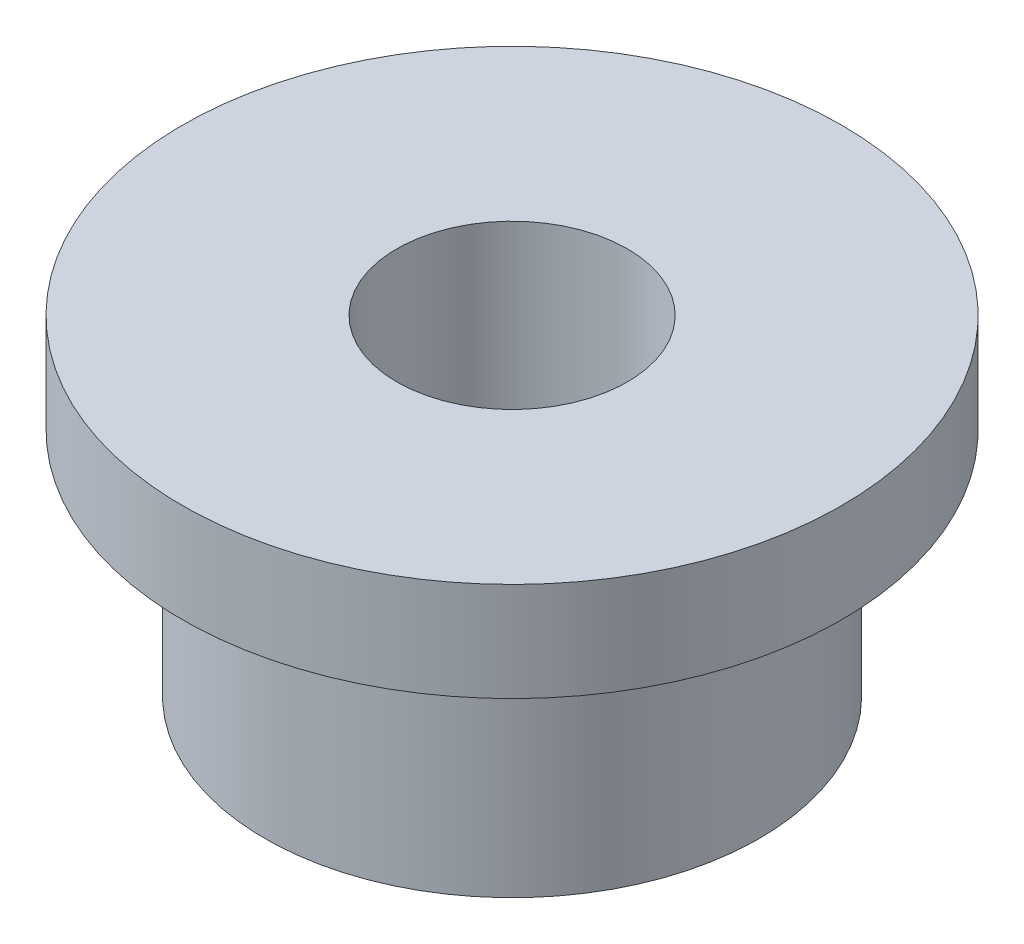
ISO-10303-21;
HEADER;
FILE_DESCRIPTION(('STEP AP214'),'2;1');
FILE_NAME('part.step','',(''),(''),'','','');
FILE_SCHEMA(('AUTOMOTIVE_DESIGN { 1 0 10303 214 1 1 1 1 }'));
ENDSEC;
DATA;
#1=APPLICATION_CONTEXT('core data for automotive mechanical design processes');
#2=APPLICATION_PROTOCOL_DEFINITION('international standard','automotive_design',2000,#1);
#3=PRODUCT_CONTEXT('',#1,'mechanical');
#4=PRODUCT('Part','Part','',(#3));
#5=PRODUCT_RELATED_PRODUCT_CATEGORY('part','',(#4));
#6=PRODUCT_DEFINITION_FORMATION('','',#4);
#7=PRODUCT_DEFINITION_CONTEXT('part definition',#1,'design');
#8=PRODUCT_DEFINITION('design','',#6,#7);
#9=PRODUCT_DEFINITION_SHAPE('','',#8);
#10=(LENGTH_UNIT() NAMED_UNIT(*) SI_UNIT(.MILLI.,.METRE.));
#11=(NAMED_UNIT(*) PLANE_ANGLE_UNIT() SI_UNIT($,.RADIAN.));
#12=(NAMED_UNIT(*) SI_UNIT($,.STERADIAN.) SOLID_ANGLE_UNIT());
#13=UNCERTAINTY_MEASURE_WITH_UNIT(LENGTH_MEASURE(1.E-05),#10,'distance_accuracy_value','');
#14=(GEOMETRIC_REPRESENTATION_CONTEXT(3) GLOBAL_UNCERTAINTY_ASSIGNED_CONTEXT((#13)) GLOBAL_UNIT_ASSIGNED_CONTEXT((#10,
#11,#12)) REPRESENTATION_CONTEXT('',''));
#15=CARTESIAN_POINT('',(0.,0.,0.));
#16=DIRECTION('',(0.,0.,1.));
#17=DIRECTION('',(1.,0.,0.));
#18=AXIS2_PLACEMENT_3D('',#15,#16,#17);
#19=CARTESIAN_POINT('',(0.,0.,0.));
#20=DIRECTION('',(0.,-1.,0.));
#21=DIRECTION('',(0.,0.,-1.));
#22=AXIS2_PLACEMENT_3D('',#19,#20,#21);
#23=CYLINDRICAL_SURFACE('',#22,3.5);
#24=CARTESIAN_POINT('',(0.,0.,0.));
#25=DIRECTION('',(0.,-1.,0.));
#26=DIRECTION('',(0.,0.,-1.));
#27=AXIS2_PLACEMENT_3D('',#24,#25,#26);
#28=CIRCLE('',#27,3.5);
#29=CARTESIAN_POINT('',(0.,0.,-3.5));
#30=VERTEX_POINT('',#29);
#31=EDGE_CURVE('E10',#30,#30,#28,.T.);
#32=ORIENTED_EDGE('',*,*,#31,.T.);
#33=EDGE_LOOP('',(#32));
#34=FACE_BOUND('',#33,.T.);
#35=CARTESIAN_POINT('',(0.,10.,0.));
#36=DIRECTION('',(0.,-1.,0.));
#37=DIRECTION('',(0.,0.,-1.));
#38=AXIS2_PLACEMENT_3D('',#35,#36,#37);
#39=CIRCLE('',#38,3.5);
#40=CARTESIAN_POINT('',(0.,10.,-3.5));
#41=VERTEX_POINT('',#40);
#42=EDGE_CURVE('E63',#41,#41,#39,.T.);
#43=ORIENTED_EDGE('',*,*,#42,.F.);
#44=EDGE_LOOP('',(#43));
#45=FACE_BOUND('',#44,.T.);
#46=ADVANCED_FACE('F41',(#34,#45),#23,.F.);
#47=CARTESIAN_POINT('',(0.,0.,0.));
#48=DIRECTION('',(0.,-1.,0.));
#49=DIRECTION('',(0.,0.,-1.));
#50=AXIS2_PLACEMENT_3D('',#47,#48,#49);
#51=PLANE('',#50);
#52=CARTESIAN_POINT('',(0.,0.,0.));
#53=DIRECTION('',(0.,-1.,0.));
#54=DIRECTION('',(0.,0.,-1.));
#55=AXIS2_PLACEMENT_3D('',#52,#53,#54);
#56=CIRCLE('',#55,7.5);
#57=CARTESIAN_POINT('',(0.,0.,-7.5));
#58=VERTEX_POINT('',#57);
#59=EDGE_CURVE('E47',#58,#58,#56,.T.);
#60=ORIENTED_EDGE('',*,*,#59,.T.);
#61=EDGE_LOOP('',(#60));
#62=FACE_BOUND('',#61,.T.);
#63=ORIENTED_EDGE('',*,*,#31,.F.);
#64=EDGE_LOOP('',(#63));
#65=FACE_BOUND('',#64,.T.);
#66=ADVANCED_FACE('F71',(#62,#65),#51,.T.);
#67=CARTESIAN_POINT('',(0.,0.,0.));
#68=DIRECTION('',(0.,-1.,0.));
#69=DIRECTION('',(0.,0.,-1.));
#70=AXIS2_PLACEMENT_3D('',#67,#68,#69);
#71=CYLINDRICAL_SURFACE('',#70,7.5);
#72=CARTESIAN_POINT('',(0.,7.,0.));
#73=DIRECTION('',(0.,-1.,0.));
#74=DIRECTION('',(0.,0.,-1.));
#75=AXIS2_PLACEMENT_3D('',#72,#73,#74);
#76=CIRCLE('',#75,7.5);
#77=CARTESIAN_POINT('',(0.,7.,-7.5));
#78=VERTEX_POINT('',#77);
#79=EDGE_CURVE('E51',#78,#78,#76,.T.);
#80=ORIENTED_EDGE('',*,*,#79,.T.);
#81=EDGE_LOOP('',(#80));
#82=FACE_BOUND('',#81,.T.);
#83=ORIENTED_EDGE('',*,*,#59,.F.);
#84=EDGE_LOOP('',(#83));
#85=FACE_BOUND('',#84,.T.);
#86=ADVANCED_FACE('F75',(#82,#85),#71,.T.);
#87=CARTESIAN_POINT('',(0.,7.,0.));
#88=DIRECTION('',(0.,1.,0.));
#89=DIRECTION('',(0.,0.,1.));
#90=AXIS2_PLACEMENT_3D('',#87,#88,#89);
#91=PLANE('',#90);
#92=ORIENTED_EDGE('',*,*,#79,.F.);
#93=EDGE_LOOP('',(#92));
#94=FACE_BOUND('',#93,.T.);
#95=CARTESIAN_POINT('',(0.,7.,0.));
#96=DIRECTION('',(0.,-1.,0.));
#97=DIRECTION('',(0.,0.,-1.));
#98=AXIS2_PLACEMENT_3D('',#95,#96,#97);
#99=CIRCLE('',#98,10.);
#100=CARTESIAN_POINT('',(0.,7.,-10.));
#101=VERTEX_POINT('',#100);
#102=EDGE_CURVE('E55',#101,#101,#99,.T.);
#103=ORIENTED_EDGE('',*,*,#102,.T.);
#104=EDGE_LOOP('',(#103));
#105=FACE_BOUND('',#104,.T.);
#106=ADVANCED_FACE('F79',(#94,#105),#91,.F.);
#107=CARTESIAN_POINT('',(0.,0.,0.));
#108=DIRECTION('',(0.,-1.,0.));
#109=DIRECTION('',(0.,0.,-1.));
#110=AXIS2_PLACEMENT_3D('',#107,#108,#109);
#111=CYLINDRICAL_SURFACE('',#110,10.);
#112=ORIENTED_EDGE('',*,*,#102,.F.);
#113=EDGE_LOOP('',(#112));
#114=FACE_BOUND('',#113,.T.);
#115=CARTESIAN_POINT('',(0.,10.,0.));
#116=DIRECTION('',(0.,-1.,0.));
#117=DIRECTION('',(0.,0.,-1.));
#118=AXIS2_PLACEMENT_3D('',#115,#116,#117);
#119=CIRCLE('',#118,10.);
#120=CARTESIAN_POINT('',(0.,10.,-10.));
#121=VERTEX_POINT('',#120);
#122=EDGE_CURVE('E60',#121,#121,#119,.T.);
#123=ORIENTED_EDGE('',*,*,#122,.T.);
#124=EDGE_LOOP('',(#123));
#125=FACE_BOUND('',#124,.T.);
#126=ADVANCED_FACE('F86',(#114,#125),#111,.T.);
#127=CARTESIAN_POINT('',(0.,10.,0.));
#128=DIRECTION('',(0.,1.,0.));
#129=DIRECTION('',(0.,0.,1.));
#130=AXIS2_PLACEMENT_3D('',#127,#128,#129);
#131=PLANE('',#130);
#132=ORIENTED_EDGE('',*,*,#42,.T.);
#133=EDGE_LOOP('',(#132));
#134=FACE_BOUND('',#133,.T.);
#135=ORIENTED_EDGE('',*,*,#122,.F.);
#136=EDGE_LOOP('',(#135));
#137=FACE_BOUND('',#136,.T.);
#138=ADVANCED_FACE('F67',(#134,#137),#131,.T.);
#139=CLOSED_SHELL('',(#46,#66,#86,#106,#126,#138));
#140=MANIFOLD_SOLID_BREP('B2',#139);
#141=ADVANCED_BREP_SHAPE_REPRESENTATION('',(#18,#140),#14);
#142=SHAPE_DEFINITION_REPRESENTATION(#9,#141);
ENDSEC;
END-ISO-10303-21;
